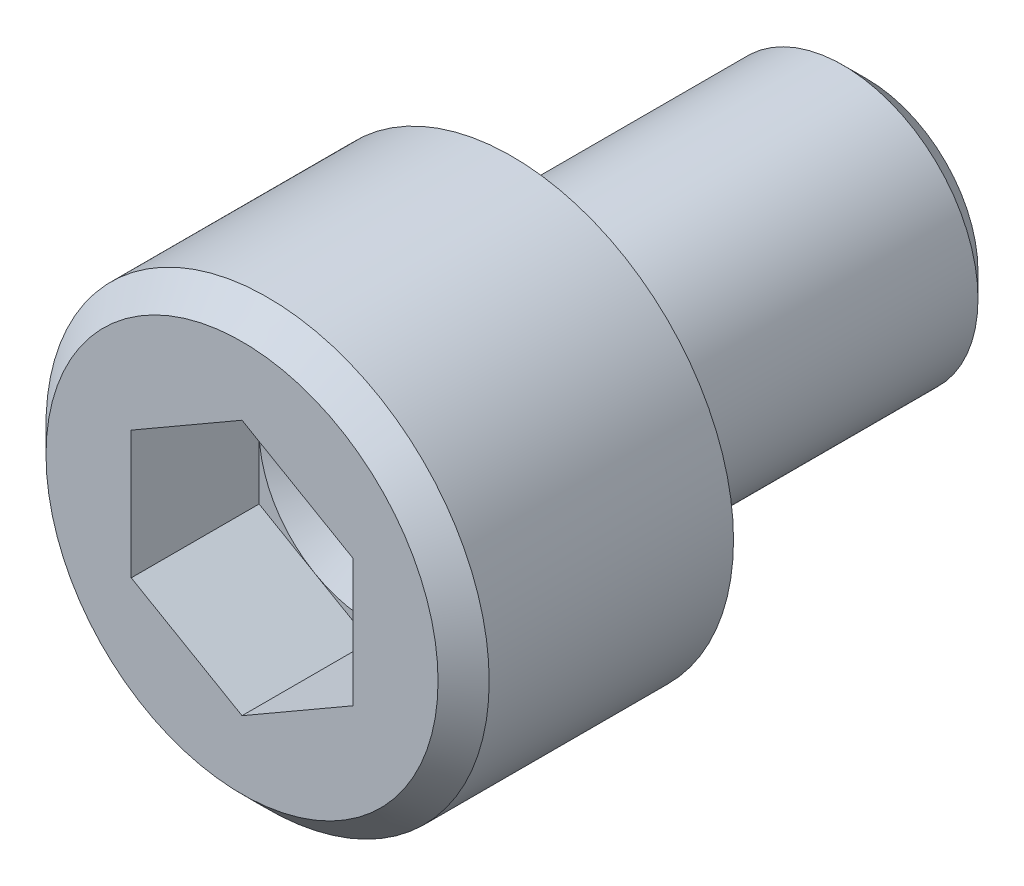
ISO-10303-21;
HEADER;
FILE_DESCRIPTION(('STEP AP214'),'2;1');
FILE_NAME('part.step','',(''),(''),'','','');
FILE_SCHEMA(('AUTOMOTIVE_DESIGN { 1 0 10303 214 1 1 1 1 }'));
ENDSEC;
DATA;
#1=APPLICATION_CONTEXT('core data for automotive mechanical design processes');
#2=APPLICATION_PROTOCOL_DEFINITION('international standard','automotive_design',2000,#1);
#3=PRODUCT_CONTEXT('',#1,'mechanical');
#4=PRODUCT('Part','Part','',(#3));
#5=PRODUCT_RELATED_PRODUCT_CATEGORY('part','',(#4));
#6=PRODUCT_DEFINITION_FORMATION('','',#4);
#7=PRODUCT_DEFINITION_CONTEXT('part definition',#1,'design');
#8=PRODUCT_DEFINITION('design','',#6,#7);
#9=PRODUCT_DEFINITION_SHAPE('','',#8);
#10=(LENGTH_UNIT() NAMED_UNIT(*) SI_UNIT(.MILLI.,.METRE.));
#11=(NAMED_UNIT(*) PLANE_ANGLE_UNIT() SI_UNIT($,.RADIAN.));
#12=(NAMED_UNIT(*) SI_UNIT($,.STERADIAN.) SOLID_ANGLE_UNIT());
#13=UNCERTAINTY_MEASURE_WITH_UNIT(LENGTH_MEASURE(1.E-05),#10,'distance_accuracy_value','');
#14=(GEOMETRIC_REPRESENTATION_CONTEXT(3) GLOBAL_UNCERTAINTY_ASSIGNED_CONTEXT((#13)) GLOBAL_UNIT_ASSIGNED_CONTEXT((#10,
#11,#12)) REPRESENTATION_CONTEXT('',''));
#15=CARTESIAN_POINT('',(0.,0.,0.));
#16=DIRECTION('',(0.,0.,1.));
#17=DIRECTION('',(1.,0.,0.));
#18=AXIS2_PLACEMENT_3D('',#15,#16,#17);
#19=CARTESIAN_POINT('',(0.,0.,2.54));
#20=DIRECTION('',(0.,0.,1.));
#21=DIRECTION('',(1.,0.,0.));
#22=AXIS2_PLACEMENT_3D('',#19,#20,#21);
#23=PLANE('',#22);
#24=DIRECTION('',(0.,1.,0.));
#25=VECTOR('',#24,1.);
#26=CARTESIAN_POINT('',(-1.9812,0.,2.54));
#27=LINE('',#26,#25);
#28=CARTESIAN_POINT('',(-1.9812,0.,2.54));
#29=VERTEX_POINT('',#28);
#30=CARTESIAN_POINT('',(-1.9812,1.14384635331848,2.54));
#31=VERTEX_POINT('',#30);
#32=EDGE_CURVE('E398',#29,#31,#27,.T.);
#33=ORIENTED_EDGE('',*,*,#32,.F.);
#34=CARTESIAN_POINT('',(0.,0.,2.54));
#35=DIRECTION('',(0.,0.,-1.));
#36=DIRECTION('',(-1.,0.,0.));
#37=AXIS2_PLACEMENT_3D('',#34,#35,#36);
#38=CIRCLE('',#37,1.9812);
#39=CARTESIAN_POINT('',(-0.9906,1.71576952997773,2.54));
#40=VERTEX_POINT('',#39);
#41=EDGE_CURVE('E33',#29,#40,#38,.T.);
#42=ORIENTED_EDGE('',*,*,#41,.T.);
#43=DIRECTION('',(0.866025403784439,0.5,0.));
#44=VECTOR('',#43,1.);
#45=CARTESIAN_POINT('',(0.163354175866616,2.38200528404682,2.54));
#46=LINE('',#45,#44);
#47=EDGE_CURVE('E393',#31,#40,#46,.T.);
#48=ORIENTED_EDGE('',*,*,#47,.F.);
#49=EDGE_LOOP('',(#33,#42,#48));
#50=FACE_BOUND('',#49,.T.);
#51=ADVANCED_FACE('F17',(#50),#23,.T.);
#52=CARTESIAN_POINT('',(0.,2.28769270663697,2.54));
#53=VERTEX_POINT('',#52);
#54=EDGE_CURVE('E390',#40,#53,#46,.T.);
#55=ORIENTED_EDGE('',*,*,#54,.F.);
#56=CARTESIAN_POINT('',(0.9906,1.71576952997773,2.54));
#57=VERTEX_POINT('',#56);
#58=EDGE_CURVE('E224',#40,#57,#38,.T.);
#59=ORIENTED_EDGE('',*,*,#58,.T.);
#60=DIRECTION('',(0.866025403784439,-0.5,0.));
#61=VECTOR('',#60,1.);
#62=CARTESIAN_POINT('',(-0.163354175866613,2.38200528404681,2.54));
#63=LINE('',#62,#61);
#64=EDGE_CURVE('E382',#53,#57,#63,.T.);
#65=ORIENTED_EDGE('',*,*,#64,.F.);
#66=EDGE_LOOP('',(#55,#59,#65));
#67=FACE_BOUND('',#66,.T.);
#68=ADVANCED_FACE('F105',(#67),#23,.T.);
#69=CARTESIAN_POINT('',(1.9812,1.14384635331849,2.54));
#70=VERTEX_POINT('',#69);
#71=EDGE_CURVE('E189',#57,#70,#63,.T.);
#72=ORIENTED_EDGE('',*,*,#71,.F.);
#73=CARTESIAN_POINT('',(1.9812,0.,2.54));
#74=VERTEX_POINT('',#73);
#75=EDGE_CURVE('E379',#57,#74,#38,.T.);
#76=ORIENTED_EDGE('',*,*,#75,.T.);
#77=DIRECTION('',(0.,-1.,0.));
#78=VECTOR('',#77,1.);
#79=CARTESIAN_POINT('',(1.9812,0.,2.54));
#80=LINE('',#79,#78);
#81=EDGE_CURVE('E160',#70,#74,#80,.T.);
#82=ORIENTED_EDGE('',*,*,#81,.F.);
#83=EDGE_LOOP('',(#72,#76,#82));
#84=FACE_BOUND('',#83,.T.);
#85=ADVANCED_FACE('F111',(#84),#23,.T.);
#86=CARTESIAN_POINT('',(1.9812,-1.14384635331849,2.54));
#87=VERTEX_POINT('',#86);
#88=EDGE_CURVE('E155',#74,#87,#80,.T.);
#89=ORIENTED_EDGE('',*,*,#88,.F.);
#90=CARTESIAN_POINT('',(0.9906,-1.71576952997773,2.54));
#91=VERTEX_POINT('',#90);
#92=EDGE_CURVE('E416',#74,#91,#38,.T.);
#93=ORIENTED_EDGE('',*,*,#92,.T.);
#94=DIRECTION('',(-0.866025403784438,-0.5,0.));
#95=VECTOR('',#94,1.);
#96=CARTESIAN_POINT('',(2.14455417586661,-1.04953377590865,2.54));
#97=LINE('',#96,#95);
#98=EDGE_CURVE('E148',#87,#91,#97,.T.);
#99=ORIENTED_EDGE('',*,*,#98,.F.);
#100=EDGE_LOOP('',(#89,#93,#99));
#101=FACE_BOUND('',#100,.T.);
#102=ADVANCED_FACE('F129',(#101),#23,.T.);
#103=CARTESIAN_POINT('',(0.,-2.28769270663697,2.54));
#104=VERTEX_POINT('',#103);
#105=EDGE_CURVE('E141',#91,#104,#97,.T.);
#106=ORIENTED_EDGE('',*,*,#105,.F.);
#107=CARTESIAN_POINT('',(-0.9906,-1.71576952997773,2.54));
#108=VERTEX_POINT('',#107);
#109=EDGE_CURVE('E143',#91,#108,#38,.T.);
#110=ORIENTED_EDGE('',*,*,#109,.T.);
#111=DIRECTION('',(-0.866025403784439,0.5,0.));
#112=VECTOR('',#111,1.);
#113=CARTESIAN_POINT('',(-2.14455417586661,-1.04953377590865,2.54));
#114=LINE('',#113,#112);
#115=EDGE_CURVE('E145',#104,#108,#114,.T.);
#116=ORIENTED_EDGE('',*,*,#115,.F.);
#117=EDGE_LOOP('',(#106,#110,#116));
#118=FACE_BOUND('',#117,.T.);
#119=ADVANCED_FACE('F119',(#118),#23,.T.);
#120=CARTESIAN_POINT('',(0.,0.,4.826));
#121=DIRECTION('',(0.,0.,1.));
#122=DIRECTION('',(1.,0.,0.));
#123=AXIS2_PLACEMENT_3D('',#120,#121,#122);
#124=PLANE('',#123);
#125=CARTESIAN_POINT('',(0.,0.,4.826));
#126=DIRECTION('',(0.,0.,1.));
#127=DIRECTION('',(1.,0.,0.));
#128=AXIS2_PLACEMENT_3D('',#125,#126,#127);
#129=CIRCLE('',#128,3.5052);
#130=CARTESIAN_POINT('',(3.5052,0.,4.826));
#131=VERTEX_POINT('',#130);
#132=EDGE_CURVE('E210',#131,#131,#129,.T.);
#133=ORIENTED_EDGE('',*,*,#132,.T.);
#134=EDGE_LOOP('',(#133));
#135=FACE_BOUND('',#134,.T.);
#136=DIRECTION('',(0.866025403784439,0.5,0.));
#137=VECTOR('',#136,1.);
#138=CARTESIAN_POINT('',(0.163354175866616,2.38200528404682,4.826));
#139=LINE('',#138,#137);
#140=CARTESIAN_POINT('',(-1.9812,1.14384635331848,4.826));
#141=VERTEX_POINT('',#140);
#142=CARTESIAN_POINT('',(0.,2.28769270663697,4.826));
#143=VERTEX_POINT('',#142);
#144=EDGE_CURVE('E171',#141,#143,#139,.T.);
#145=ORIENTED_EDGE('',*,*,#144,.T.);
#146=DIRECTION('',(0.866025403784439,-0.5,0.));
#147=VECTOR('',#146,1.);
#148=CARTESIAN_POINT('',(-0.163354175866613,2.38200528404681,4.826));
#149=LINE('',#148,#147);
#150=CARTESIAN_POINT('',(1.9812,1.14384635331849,4.826));
#151=VERTEX_POINT('',#150);
#152=EDGE_CURVE('E167',#143,#151,#149,.T.);
#153=ORIENTED_EDGE('',*,*,#152,.T.);
#154=DIRECTION('',(0.,-1.,0.));
#155=VECTOR('',#154,1.);
#156=CARTESIAN_POINT('',(1.9812,0.,4.826));
#157=LINE('',#156,#155);
#158=CARTESIAN_POINT('',(1.9812,-1.14384635331849,4.826));
#159=VERTEX_POINT('',#158);
#160=EDGE_CURVE('E185',#151,#159,#157,.T.);
#161=ORIENTED_EDGE('',*,*,#160,.T.);
#162=DIRECTION('',(-0.866025403784438,-0.5,0.));
#163=VECTOR('',#162,1.);
#164=CARTESIAN_POINT('',(2.14455417586661,-1.04953377590865,4.826));
#165=LINE('',#164,#163);
#166=CARTESIAN_POINT('',(0.,-2.28769270663697,4.826));
#167=VERTEX_POINT('',#166);
#168=EDGE_CURVE('E41',#159,#167,#165,.T.);
#169=ORIENTED_EDGE('',*,*,#168,.T.);
#170=DIRECTION('',(-0.866025403784439,0.5,0.));
#171=VECTOR('',#170,1.);
#172=CARTESIAN_POINT('',(-2.14455417586661,-1.04953377590865,4.826));
#173=LINE('',#172,#171);
#174=CARTESIAN_POINT('',(-1.9812,-1.14384635331849,4.826));
#175=VERTEX_POINT('',#174);
#176=EDGE_CURVE('E179',#167,#175,#173,.T.);
#177=ORIENTED_EDGE('',*,*,#176,.T.);
#178=DIRECTION('',(0.,1.,0.));
#179=VECTOR('',#178,1.);
#180=CARTESIAN_POINT('',(-1.9812,0.,4.826));
#181=LINE('',#180,#179);
#182=EDGE_CURVE('E175',#175,#141,#181,.T.);
#183=ORIENTED_EDGE('',*,*,#182,.T.);
#184=EDGE_LOOP('',(#145,#153,#161,#169,#177,#183));
#185=FACE_BOUND('',#184,.T.);
#186=ADVANCED_FACE('F128',(#135,#185),#124,.T.);
#187=CARTESIAN_POINT('',(0.,0.,4.826));
#188=DIRECTION('',(0.,0.,-1.));
#189=DIRECTION('',(-1.,0.,0.));
#190=AXIS2_PLACEMENT_3D('',#187,#188,#189);
#191=CYLINDRICAL_SURFACE('',#190,3.9624);
#192=CARTESIAN_POINT('',(0.,0.,4.3688));
#193=DIRECTION('',(0.,0.,1.));
#194=DIRECTION('',(1.,0.,0.));
#195=AXIS2_PLACEMENT_3D('',#192,#193,#194);
#196=CIRCLE('',#195,3.9624);
#197=CARTESIAN_POINT('',(3.9624,0.,4.3688));
#198=VERTEX_POINT('',#197);
#199=EDGE_CURVE('E214',#198,#198,#196,.F.);
#200=ORIENTED_EDGE('',*,*,#199,.T.);
#201=EDGE_LOOP('',(#200));
#202=FACE_BOUND('',#201,.T.);
#203=CARTESIAN_POINT('',(0.,0.,0.));
#204=DIRECTION('',(0.,0.,1.));
#205=DIRECTION('',(1.,0.,0.));
#206=AXIS2_PLACEMENT_3D('',#203,#204,#205);
#207=CIRCLE('',#206,3.9624);
#208=CARTESIAN_POINT('',(3.9624,0.,0.));
#209=VERTEX_POINT('',#208);
#210=EDGE_CURVE('E206',#209,#209,#207,.T.);
#211=ORIENTED_EDGE('',*,*,#210,.T.);
#212=EDGE_LOOP('',(#211));
#213=FACE_BOUND('',#212,.T.);
#214=ADVANCED_FACE('F134',(#202,#213),#191,.T.);
#215=CARTESIAN_POINT('',(0.,0.,0.));
#216=DIRECTION('',(0.,0.,1.));
#217=DIRECTION('',(1.,0.,0.));
#218=AXIS2_PLACEMENT_3D('',#215,#216,#217);
#219=PLANE('',#218);
#220=CARTESIAN_POINT('',(0.,0.,0.));
#221=DIRECTION('',(0.,0.,1.));
#222=DIRECTION('',(1.,0.,0.));
#223=AXIS2_PLACEMENT_3D('',#220,#221,#222);
#224=CIRCLE('',#223,2.5654);
#225=CARTESIAN_POINT('',(2.5654,0.,0.));
#226=VERTEX_POINT('',#225);
#227=EDGE_CURVE('E223',#226,#226,#224,.T.);
#228=ORIENTED_EDGE('',*,*,#227,.T.);
#229=EDGE_LOOP('',(#228));
#230=FACE_BOUND('',#229,.T.);
#231=ORIENTED_EDGE('',*,*,#210,.F.);
#232=EDGE_LOOP('',(#231));
#233=FACE_BOUND('',#232,.T.);
#234=ADVANCED_FACE('F323',(#230,#233),#219,.F.);
#235=CARTESIAN_POINT('',(0.,0.,4.826));
#236=DIRECTION('',(0.,0.,-1.));
#237=DIRECTION('',(-1.,0.,0.));
#238=AXIS2_PLACEMENT_3D('',#235,#236,#237);
#239=CONICAL_SURFACE('',#238,3.5052,0.785398163397449);
#240=ORIENTED_EDGE('',*,*,#199,.F.);
#241=EDGE_LOOP('',(#240));
#242=FACE_BOUND('',#241,.T.);
#243=ORIENTED_EDGE('',*,*,#132,.F.);
#244=EDGE_LOOP('',(#243));
#245=FACE_BOUND('',#244,.T.);
#246=ADVANCED_FACE('F314',(#242,#245),#239,.T.);
#247=CARTESIAN_POINT('',(-0.163354175866613,2.38200528404681,2.54));
#248=DIRECTION('',(-0.5,-0.866025403784439,0.));
#249=DIRECTION('',(0.866025403784439,-0.5,0.));
#250=AXIS2_PLACEMENT_3D('',#247,#248,#249);
#251=PLANE('',#250);
#252=ORIENTED_EDGE('',*,*,#152,.F.);
#253=DIRECTION('',(0.,0.,1.));
#254=VECTOR('',#253,1.);
#255=CARTESIAN_POINT('',(0.,2.28769270663697,2.54));
#256=LINE('',#255,#254);
#257=EDGE_CURVE('E203',#53,#143,#256,.T.);
#258=ORIENTED_EDGE('',*,*,#257,.F.);
#259=ORIENTED_EDGE('',*,*,#64,.T.);
#260=ORIENTED_EDGE('',*,*,#71,.T.);
#261=DIRECTION('',(0.,0.,1.));
#262=VECTOR('',#261,1.);
#263=CARTESIAN_POINT('',(1.9812,1.14384635331849,2.54));
#264=LINE('',#263,#262);
#265=EDGE_CURVE('E166',#70,#151,#264,.T.);
#266=ORIENTED_EDGE('',*,*,#265,.T.);
#267=EDGE_LOOP('',(#252,#258,#259,#260,#266));
#268=FACE_BOUND('',#267,.T.);
#269=ADVANCED_FACE('F305',(#268),#251,.T.);
#270=CARTESIAN_POINT('',(0.163354175866616,2.38200528404682,2.54));
#271=DIRECTION('',(0.5,-0.866025403784438,0.));
#272=DIRECTION('',(0.866025403784438,0.5,0.));
#273=AXIS2_PLACEMENT_3D('',#270,#271,#272);
#274=PLANE('',#273);
#275=ORIENTED_EDGE('',*,*,#144,.F.);
#276=DIRECTION('',(0.,0.,1.));
#277=VECTOR('',#276,1.);
#278=CARTESIAN_POINT('',(-1.9812,1.14384635331848,2.54));
#279=LINE('',#278,#277);
#280=EDGE_CURVE('E200',#31,#141,#279,.T.);
#281=ORIENTED_EDGE('',*,*,#280,.F.);
#282=ORIENTED_EDGE('',*,*,#47,.T.);
#283=ORIENTED_EDGE('',*,*,#54,.T.);
#284=ORIENTED_EDGE('',*,*,#257,.T.);
#285=EDGE_LOOP('',(#275,#281,#282,#283,#284));
#286=FACE_BOUND('',#285,.T.);
#287=ADVANCED_FACE('F296',(#286),#274,.T.);
#288=CARTESIAN_POINT('',(-1.9812,0.,2.54));
#289=DIRECTION('',(1.,0.,0.));
#290=DIRECTION('',(0.,1.,0.));
#291=AXIS2_PLACEMENT_3D('',#288,#289,#290);
#292=PLANE('',#291);
#293=ORIENTED_EDGE('',*,*,#182,.F.);
#294=DIRECTION('',(0.,0.,1.));
#295=VECTOR('',#294,1.);
#296=CARTESIAN_POINT('',(-1.9812,-1.14384635331849,2.54));
#297=LINE('',#296,#295);
#298=CARTESIAN_POINT('',(-1.9812,-1.14384635331849,2.54));
#299=VERTEX_POINT('',#298);
#300=EDGE_CURVE('E197',#299,#175,#297,.T.);
#301=ORIENTED_EDGE('',*,*,#300,.F.);
#302=EDGE_CURVE('E399',#299,#29,#27,.T.);
#303=ORIENTED_EDGE('',*,*,#302,.T.);
#304=ORIENTED_EDGE('',*,*,#32,.T.);
#305=ORIENTED_EDGE('',*,*,#280,.T.);
#306=EDGE_LOOP('',(#293,#301,#303,#304,#305));
#307=FACE_BOUND('',#306,.T.);
#308=ADVANCED_FACE('F287',(#307),#292,.T.);
#309=CARTESIAN_POINT('',(-2.14455417586661,-1.04953377590865,2.54));
#310=DIRECTION('',(0.5,0.866025403784439,0.));
#311=DIRECTION('',(-0.866025403784439,0.5,0.));
#312=AXIS2_PLACEMENT_3D('',#309,#310,#311);
#313=PLANE('',#312);
#314=ORIENTED_EDGE('',*,*,#176,.F.);
#315=DIRECTION('',(0.,0.,1.));
#316=VECTOR('',#315,1.);
#317=CARTESIAN_POINT('',(0.,-2.28769270663697,2.54));
#318=LINE('',#317,#316);
#319=EDGE_CURVE('E194',#104,#167,#318,.T.);
#320=ORIENTED_EDGE('',*,*,#319,.F.);
#321=ORIENTED_EDGE('',*,*,#115,.T.);
#322=EDGE_CURVE('E401',#108,#299,#114,.T.);
#323=ORIENTED_EDGE('',*,*,#322,.T.);
#324=ORIENTED_EDGE('',*,*,#300,.T.);
#325=EDGE_LOOP('',(#314,#320,#321,#323,#324));
#326=FACE_BOUND('',#325,.T.);
#327=ADVANCED_FACE('F279',(#326),#313,.T.);
#328=CARTESIAN_POINT('',(2.14455417586661,-1.04953377590865,2.54));
#329=DIRECTION('',(-0.5,0.866025403784438,0.));
#330=DIRECTION('',(-0.866025403784438,-0.5,0.));
#331=AXIS2_PLACEMENT_3D('',#328,#329,#330);
#332=PLANE('',#331);
#333=ORIENTED_EDGE('',*,*,#168,.F.);
#334=DIRECTION('',(0.,0.,1.));
#335=VECTOR('',#334,1.);
#336=CARTESIAN_POINT('',(1.9812,-1.14384635331849,2.54));
#337=LINE('',#336,#335);
#338=EDGE_CURVE('E151',#87,#159,#337,.T.);
#339=ORIENTED_EDGE('',*,*,#338,.F.);
#340=ORIENTED_EDGE('',*,*,#98,.T.);
#341=ORIENTED_EDGE('',*,*,#105,.T.);
#342=ORIENTED_EDGE('',*,*,#319,.T.);
#343=EDGE_LOOP('',(#333,#339,#340,#341,#342));
#344=FACE_BOUND('',#343,.T.);
#345=ADVANCED_FACE('F124',(#344),#332,.T.);
#346=CARTESIAN_POINT('',(1.9812,0.,2.54));
#347=DIRECTION('',(-1.,0.,0.));
#348=DIRECTION('',(0.,-1.,0.));
#349=AXIS2_PLACEMENT_3D('',#346,#347,#348);
#350=PLANE('',#349);
#351=ORIENTED_EDGE('',*,*,#160,.F.);
#352=ORIENTED_EDGE('',*,*,#265,.F.);
#353=ORIENTED_EDGE('',*,*,#81,.T.);
#354=ORIENTED_EDGE('',*,*,#88,.T.);
#355=ORIENTED_EDGE('',*,*,#338,.T.);
#356=EDGE_LOOP('',(#351,#352,#353,#354,#355));
#357=FACE_BOUND('',#356,.T.);
#358=ADVANCED_FACE('F117',(#357),#350,.T.);
#359=ORIENTED_EDGE('',*,*,#322,.F.);
#360=EDGE_CURVE('E218',#108,#29,#38,.T.);
#361=ORIENTED_EDGE('',*,*,#360,.T.);
#362=ORIENTED_EDGE('',*,*,#302,.F.);
#363=EDGE_LOOP('',(#359,#361,#362));
#364=FACE_BOUND('',#363,.T.);
#365=ADVANCED_FACE('F108',(#364),#23,.T.);
#366=CARTESIAN_POINT('',(0.,0.,-6.35));
#367=DIRECTION('',(0.,0.,1.));
#368=DIRECTION('',(1.,0.,0.));
#369=AXIS2_PLACEMENT_3D('',#366,#367,#368);
#370=CYLINDRICAL_SURFACE('',#369,2.413);
#371=CARTESIAN_POINT('',(0.,0.,-5.92105761938));
#372=DIRECTION('',(0.,0.,-1.));
#373=DIRECTION('',(-1.,0.,0.));
#374=AXIS2_PLACEMENT_3D('',#371,#372,#373);
#375=CIRCLE('',#374,2.413);
#376=CARTESIAN_POINT('',(-2.413,0.,-5.92105761938));
#377=VERTEX_POINT('',#376);
#378=EDGE_CURVE('E11',#377,#377,#375,.F.);
#379=ORIENTED_EDGE('',*,*,#378,.T.);
#380=EDGE_LOOP('',(#379));
#381=FACE_BOUND('',#380,.T.);
#382=CARTESIAN_POINT('',(0.,0.,-0.1524));
#383=DIRECTION('',(0.,0.,1.));
#384=DIRECTION('',(1.,0.,0.));
#385=AXIS2_PLACEMENT_3D('',#382,#383,#384);
#386=CIRCLE('',#385,2.413);
#387=CARTESIAN_POINT('',(2.413,0.,-0.1524));
#388=VERTEX_POINT('',#387);
#389=EDGE_CURVE('E219',#388,#388,#386,.F.);
#390=ORIENTED_EDGE('',*,*,#389,.T.);
#391=EDGE_LOOP('',(#390));
#392=FACE_BOUND('',#391,.T.);
#393=ADVANCED_FACE('F101',(#381,#392),#370,.T.);
#394=CARTESIAN_POINT('',(0.,0.,-6.35));
#395=DIRECTION('',(0.,0.,-1.));
#396=DIRECTION('',(1.,0.,0.));
#397=AXIS2_PLACEMENT_3D('',#394,#395,#396);
#398=PLANE('',#397);
#399=CARTESIAN_POINT('',(0.,0.,-6.35));
#400=DIRECTION('',(0.,0.,-1.));
#401=DIRECTION('',(-1.,0.,0.));
#402=AXIS2_PLACEMENT_3D('',#399,#400,#401);
#403=CIRCLE('',#402,1.98405761938);
#404=CARTESIAN_POINT('',(-1.98405761938,0.,-6.35));
#405=VERTEX_POINT('',#404);
#406=EDGE_CURVE('E26',#405,#405,#403,.T.);
#407=ORIENTED_EDGE('',*,*,#406,.T.);
#408=EDGE_LOOP('',(#407));
#409=FACE_BOUND('',#408,.T.);
#410=ADVANCED_FACE('F94',(#409),#398,.T.);
#411=CARTESIAN_POINT('',(0.,0.,1.39615364668151));
#412=DIRECTION('',(0.,0.,1.));
#413=DIRECTION('',(1.,0.,0.));
#414=AXIS2_PLACEMENT_3D('',#411,#412,#413);
#415=CONICAL_SURFACE('',#414,0.,1.0471975511966);
#416=ORIENTED_EDGE('',*,*,#41,.F.);
#417=ORIENTED_EDGE('',*,*,#360,.F.);
#418=ORIENTED_EDGE('',*,*,#109,.F.);
#419=ORIENTED_EDGE('',*,*,#92,.F.);
#420=ORIENTED_EDGE('',*,*,#75,.F.);
#421=ORIENTED_EDGE('',*,*,#58,.F.);
#422=EDGE_LOOP('',(#416,#417,#418,#419,#420,#421));
#423=FACE_BOUND('',#422,.T.);
#424=CARTESIAN_POINT('',(0.,0.,1.39615364668151));
#425=VERTEX_POINT('',#424);
#426=VERTEX_LOOP('',#425);
#427=FACE_BOUND('',#426,.T.);
#428=ADVANCED_FACE('F91',(#423,#427),#415,.F.);
#429=CARTESIAN_POINT('',(0.,0.,-0.1524));
#430=DIRECTION('',(0.,0.,1.));
#431=DIRECTION('',(1.,0.,0.));
#432=AXIS2_PLACEMENT_3D('',#429,#430,#431);
#433=TOROIDAL_SURFACE('',#432,2.5654,0.1524);
#434=ORIENTED_EDGE('',*,*,#227,.F.);
#435=EDGE_LOOP('',(#434));
#436=FACE_BOUND('',#435,.T.);
#437=ORIENTED_EDGE('',*,*,#389,.F.);
#438=EDGE_LOOP('',(#437));
#439=FACE_BOUND('',#438,.T.);
#440=ADVANCED_FACE('F93',(#436,#439),#433,.F.);
#441=CARTESIAN_POINT('',(0.,0.,-6.35));
#442=DIRECTION('',(0.,0.,1.));
#443=DIRECTION('',(1.,0.,0.));
#444=AXIS2_PLACEMENT_3D('',#441,#442,#443);
#445=CONICAL_SURFACE('',#444,1.98405761938,0.785398163397448);
#446=ORIENTED_EDGE('',*,*,#378,.F.);
#447=EDGE_LOOP('',(#446));
#448=FACE_BOUND('',#447,.T.);
#449=ORIENTED_EDGE('',*,*,#406,.F.);
#450=EDGE_LOOP('',(#449));
#451=FACE_BOUND('',#450,.T.);
#452=ADVANCED_FACE('F19',(#448,#451),#445,.T.);
#453=CLOSED_SHELL('',(#51,#68,#85,#102,#119,#186,#214,#234,#246,#269,#287,#308,#327,#345,#358,
#365,#393,#410,#428,#440,#452));
#454=MANIFOLD_SOLID_BREP('B1',#453);
#455=ADVANCED_BREP_SHAPE_REPRESENTATION('',(#18,#454),#14);
#456=SHAPE_DEFINITION_REPRESENTATION(#9,#455);
ENDSEC;
END-ISO-10303-21;
